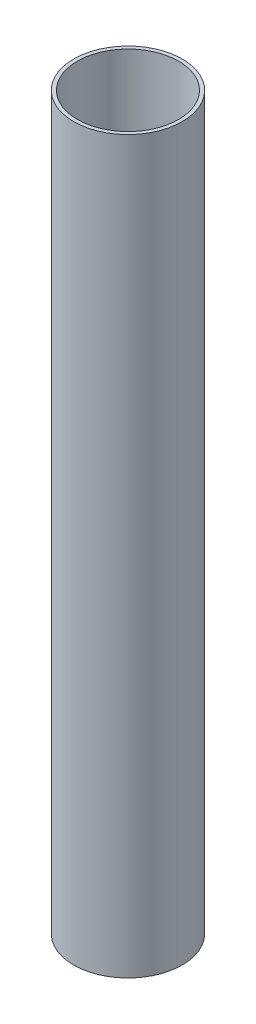
ISO-10303-21;
HEADER;
FILE_DESCRIPTION(('STEP AP214'),'2;1');
FILE_NAME('part.step','',(''),(''),'','','');
FILE_SCHEMA(('AUTOMOTIVE_DESIGN { 1 0 10303 214 1 1 1 1 }'));
ENDSEC;
DATA;
#1=APPLICATION_CONTEXT('core data for automotive mechanical design processes');
#2=APPLICATION_PROTOCOL_DEFINITION('international standard','automotive_design',2000,#1);
#3=PRODUCT_CONTEXT('',#1,'mechanical');
#4=PRODUCT('Part','Part','',(#3));
#5=PRODUCT_RELATED_PRODUCT_CATEGORY('part','',(#4));
#6=PRODUCT_DEFINITION_FORMATION('','',#4);
#7=PRODUCT_DEFINITION_CONTEXT('part definition',#1,'design');
#8=PRODUCT_DEFINITION('design','',#6,#7);
#9=PRODUCT_DEFINITION_SHAPE('','',#8);
#10=(LENGTH_UNIT() NAMED_UNIT(*) SI_UNIT(.MILLI.,.METRE.));
#11=(NAMED_UNIT(*) PLANE_ANGLE_UNIT() SI_UNIT($,.RADIAN.));
#12=(NAMED_UNIT(*) SI_UNIT($,.STERADIAN.) SOLID_ANGLE_UNIT());
#13=UNCERTAINTY_MEASURE_WITH_UNIT(LENGTH_MEASURE(1.E-05),#10,'distance_accuracy_value','');
#14=(GEOMETRIC_REPRESENTATION_CONTEXT(3) GLOBAL_UNCERTAINTY_ASSIGNED_CONTEXT((#13)) GLOBAL_UNIT_ASSIGNED_CONTEXT((#10,
#11,#12)) REPRESENTATION_CONTEXT('',''));
#15=CARTESIAN_POINT('',(0.,0.,0.));
#16=DIRECTION('',(0.,0.,1.));
#17=DIRECTION('',(1.,0.,0.));
#18=AXIS2_PLACEMENT_3D('',#15,#16,#17);
#19=CARTESIAN_POINT('',(0.,279.4,0.));
#20=DIRECTION('',(0.,1.,0.));
#21=DIRECTION('',(0.,0.,1.));
#22=AXIS2_PLACEMENT_3D('',#19,#20,#21);
#23=PLANE('',#22);
#24=CARTESIAN_POINT('',(0.,279.4,0.));
#25=DIRECTION('',(0.,1.,0.));
#26=DIRECTION('',(0.,0.,1.));
#27=AXIS2_PLACEMENT_3D('',#24,#25,#26);
#28=CIRCLE('',#27,20.7518);
#29=CARTESIAN_POINT('',(0.,279.4,20.7518));
#30=VERTEX_POINT('',#29);
#31=EDGE_CURVE('E10',#30,#30,#28,.T.);
#32=ORIENTED_EDGE('',*,*,#31,.T.);
#33=EDGE_LOOP('',(#32));
#34=FACE_BOUND('',#33,.T.);
#35=CARTESIAN_POINT('',(0.,279.4,0.));
#36=DIRECTION('',(0.,1.,0.));
#37=DIRECTION('',(0.,0.,1.));
#38=AXIS2_PLACEMENT_3D('',#35,#36,#37);
#39=CIRCLE('',#38,19.3548);
#40=CARTESIAN_POINT('',(0.,279.4,19.3548));
#41=VERTEX_POINT('',#40);
#42=EDGE_CURVE('E46',#41,#41,#39,.T.);
#43=ORIENTED_EDGE('',*,*,#42,.F.);
#44=EDGE_LOOP('',(#43));
#45=FACE_BOUND('',#44,.T.);
#46=ADVANCED_FACE('F35',(#34,#45),#23,.T.);
#47=CARTESIAN_POINT('',(0.,0.,0.));
#48=DIRECTION('',(0.,1.,0.));
#49=DIRECTION('',(0.,0.,1.));
#50=AXIS2_PLACEMENT_3D('',#47,#48,#49);
#51=PLANE('',#50);
#52=CARTESIAN_POINT('',(0.,0.,0.));
#53=DIRECTION('',(0.,1.,0.));
#54=DIRECTION('',(0.,0.,1.));
#55=AXIS2_PLACEMENT_3D('',#52,#53,#54);
#56=CIRCLE('',#55,20.7518);
#57=CARTESIAN_POINT('',(0.,0.,20.7518));
#58=VERTEX_POINT('',#57);
#59=EDGE_CURVE('E39',#58,#58,#56,.T.);
#60=ORIENTED_EDGE('',*,*,#59,.F.);
#61=EDGE_LOOP('',(#60));
#62=FACE_BOUND('',#61,.T.);
#63=CARTESIAN_POINT('',(0.,0.,0.));
#64=DIRECTION('',(0.,1.,0.));
#65=DIRECTION('',(0.,0.,1.));
#66=AXIS2_PLACEMENT_3D('',#63,#64,#65);
#67=CIRCLE('',#66,19.3548);
#68=CARTESIAN_POINT('',(0.,0.,19.3548));
#69=VERTEX_POINT('',#68);
#70=EDGE_CURVE('E48',#69,#69,#67,.T.);
#71=ORIENTED_EDGE('',*,*,#70,.T.);
#72=EDGE_LOOP('',(#71));
#73=FACE_BOUND('',#72,.T.);
#74=ADVANCED_FACE('F58',(#62,#73),#51,.F.);
#75=CARTESIAN_POINT('',(0.,279.4,0.));
#76=DIRECTION('',(0.,-1.,0.));
#77=DIRECTION('',(0.,0.,-1.));
#78=AXIS2_PLACEMENT_3D('',#75,#76,#77);
#79=CYLINDRICAL_SURFACE('',#78,20.7518);
#80=ORIENTED_EDGE('',*,*,#31,.F.);
#81=EDGE_LOOP('',(#80));
#82=FACE_BOUND('',#81,.T.);
#83=ORIENTED_EDGE('',*,*,#59,.T.);
#84=EDGE_LOOP('',(#83));
#85=FACE_BOUND('',#84,.T.);
#86=ADVANCED_FACE('F37',(#82,#85),#79,.T.);
#87=CARTESIAN_POINT('',(0.,279.4,0.));
#88=DIRECTION('',(0.,-1.,0.));
#89=DIRECTION('',(0.,0.,-1.));
#90=AXIS2_PLACEMENT_3D('',#87,#88,#89);
#91=CYLINDRICAL_SURFACE('',#90,19.3548);
#92=ORIENTED_EDGE('',*,*,#42,.T.);
#93=EDGE_LOOP('',(#92));
#94=FACE_BOUND('',#93,.T.);
#95=ORIENTED_EDGE('',*,*,#70,.F.);
#96=EDGE_LOOP('',(#95));
#97=FACE_BOUND('',#96,.T.);
#98=ADVANCED_FACE('F54',(#94,#97),#91,.F.);
#99=CLOSED_SHELL('',(#46,#74,#86,#98));
#100=MANIFOLD_SOLID_BREP('B2',#99);
#101=ADVANCED_BREP_SHAPE_REPRESENTATION('',(#18,#100),#14);
#102=SHAPE_DEFINITION_REPRESENTATION(#9,#101);
ENDSEC;
END-ISO-10303-21;
